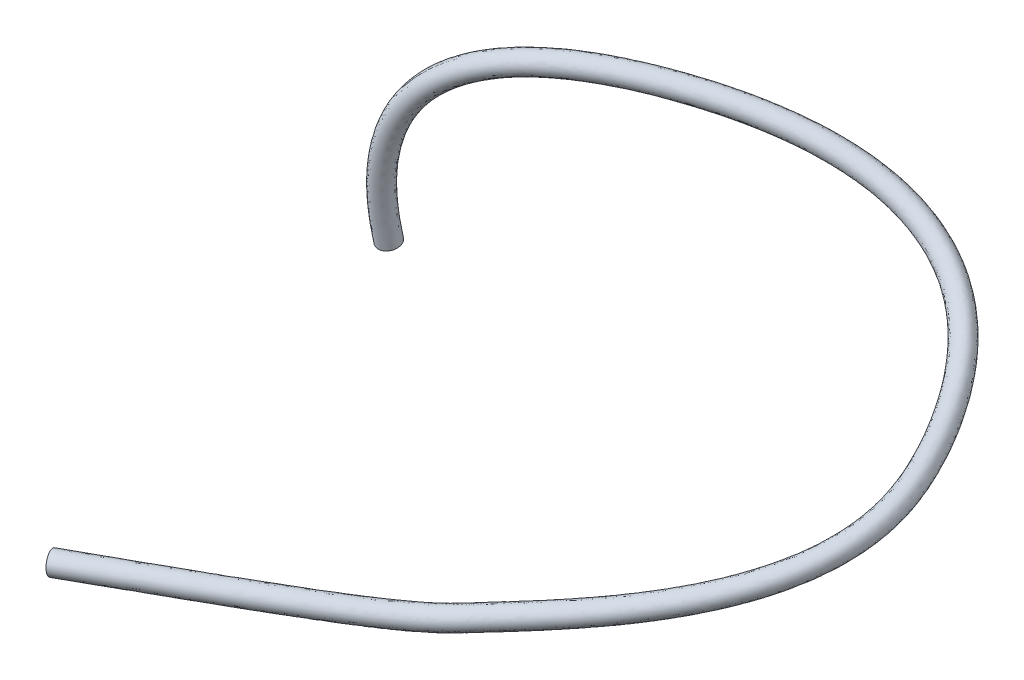
ISO-10303-21;
HEADER;
FILE_DESCRIPTION(('STEP AP214'),'2;1');
FILE_NAME('part.step','',(''),(''),'','','');
FILE_SCHEMA(('AUTOMOTIVE_DESIGN { 1 0 10303 214 1 1 1 1 }'));
ENDSEC;
DATA;
#1=APPLICATION_CONTEXT('core data for automotive mechanical design processes');
#2=APPLICATION_PROTOCOL_DEFINITION('international standard','automotive_design',2000,#1);
#3=PRODUCT_CONTEXT('',#1,'mechanical');
#4=PRODUCT('Part','Part','',(#3));
#5=PRODUCT_RELATED_PRODUCT_CATEGORY('part','',(#4));
#6=PRODUCT_DEFINITION_FORMATION('','',#4);
#7=PRODUCT_DEFINITION_CONTEXT('part definition',#1,'design');
#8=PRODUCT_DEFINITION('design','',#6,#7);
#9=PRODUCT_DEFINITION_SHAPE('','',#8);
#10=(LENGTH_UNIT() NAMED_UNIT(*) SI_UNIT(.MILLI.,.METRE.));
#11=(NAMED_UNIT(*) PLANE_ANGLE_UNIT() SI_UNIT($,.RADIAN.));
#12=(NAMED_UNIT(*) SI_UNIT($,.STERADIAN.) SOLID_ANGLE_UNIT());
#13=UNCERTAINTY_MEASURE_WITH_UNIT(LENGTH_MEASURE(1.E-05),#10,'distance_accuracy_value','');
#14=(GEOMETRIC_REPRESENTATION_CONTEXT(3) GLOBAL_UNCERTAINTY_ASSIGNED_CONTEXT((#13)) GLOBAL_UNIT_ASSIGNED_CONTEXT((#10,
#11,#12)) REPRESENTATION_CONTEXT('',''));
#15=CARTESIAN_POINT('',(0.,0.,0.));
#16=DIRECTION('',(0.,0.,1.));
#17=DIRECTION('',(1.,0.,0.));
#18=AXIS2_PLACEMENT_3D('',#15,#16,#17);
#19=CARTESIAN_POINT('',(0.,0.,0.));
#20=DIRECTION('',(0.921927770547617,0.0852639485478055,-0.377861409740579));
#21=DIRECTION('',(-0.379242459494536,0.,-0.925297334329098));
#22=AXIS2_PLACEMENT_3D('',#19,#20,#21);
#23=PLANE('',#22);
#24=CARTESIAN_POINT('',(0.,0.,0.));
#25=DIRECTION('',(0.921927770547617,0.0852639485478055,-0.377861409740579));
#26=DIRECTION('',(-0.379242459494536,0.,-0.925297334329098));
#27=AXIS2_PLACEMENT_3D('',#24,#25,#26);
#28=CIRCLE('',#27,0.7);
#29=CARTESIAN_POINT('',(-0.265469721646175,0.,-0.647708134030369));
#30=VERTEX_POINT('',#29);
#31=EDGE_CURVE('E44',#30,#30,#28,.T.);
#32=ORIENTED_EDGE('',*,*,#31,.F.);
#33=EDGE_LOOP('',(#32));
#34=FACE_BOUND('',#33,.T.);
#35=ADVANCED_FACE('F38',(#34),#23,.F.);
#36=CARTESIAN_POINT('',(-5.57062917774055,1.68555245021381,-27.7769632366974));
#37=DIRECTION('',(0.0297499683186175,-0.979324675837005,-0.20009527401162));
#38=DIRECTION('',(0.839482302263919,0.133142151646618,-0.526823150251179));
#39=AXIS2_PLACEMENT_3D('',#36,#37,#38);
#40=PLANE('',#39);
#41=CARTESIAN_POINT('',(-5.57062917774055,1.68555245021381,-27.7769632366974));
#42=DIRECTION('',(0.0297499683186175,-0.979324675837005,-0.20009527401162));
#43=DIRECTION('',(0.839482302263919,0.133142151646618,-0.526823150251179));
#44=AXIS2_PLACEMENT_3D('',#41,#42,#43);
#45=CIRCLE('',#44,0.7);
#46=CARTESIAN_POINT('',(-4.9829915661558,1.77875195636644,-28.1457394418732));
#47=VERTEX_POINT('',#46);
#48=EDGE_CURVE('E10',#47,#47,#45,.T.);
#49=ORIENTED_EDGE('',*,*,#48,.T.);
#50=EDGE_LOOP('',(#49));
#51=FACE_BOUND('',#50,.T.);
#52=ADVANCED_FACE('F54',(#51),#40,.T.);
#53=CARTESIAN_POINT('',(-0.265469721646175,0.,-0.647708134030369));
#54=CARTESIAN_POINT('',(8.04734689797541,0.768805964165485,-4.05479999862704));
#55=CARTESIAN_POINT('',(12.3484093248188,1.22838460898763,-5.81049366290598));
#56=CARTESIAN_POINT('',(17.5599920455362,1.99534837302523,-7.98837642652316));
#57=CARTESIAN_POINT('',(18.4603030728046,2.29892115922044,-8.40554721821385));
#58=CARTESIAN_POINT('',(21.0902341526972,3.08996730017522,-9.67343388171896));
#59=CARTESIAN_POINT('',(22.4586381776187,3.47424883781394,-10.3421751297523));
#60=CARTESIAN_POINT('',(25.3065169394912,4.407975777979,-11.9742573344746));
#61=CARTESIAN_POINT('',(26.7994868445815,4.89454978585081,-12.94498891061));
#62=CARTESIAN_POINT('',(29.4443901043949,5.88640908324926,-15.1780349631807));
#63=CARTESIAN_POINT('',(30.5942325367993,6.38772173710995,-16.439904674247));
#64=CARTESIAN_POINT('',(32.1180610249669,7.33728800837294,-19.2117081331931));
#65=CARTESIAN_POINT('',(32.4995446619067,7.78360543197781,-20.7108380500078));
#66=CARTESIAN_POINT('',(32.2191859064397,8.39964260793526,-23.2303285719821));
#67=CARTESIAN_POINT('',(31.969766234403,8.60285047913527,-24.1520790348935));
#68=CARTESIAN_POINT('',(31.2873226083179,9.01388339667321,-25.976768871155));
#69=CARTESIAN_POINT('',(30.8535934152514,9.23126434571914,-26.875973582872));
#70=CARTESIAN_POINT('',(29.2700527287804,9.95748660976253,-29.8096529840923));
#71=CARTESIAN_POINT('',(28.0457719773137,10.5510144180114,-31.3476782521876));
#72=CARTESIAN_POINT('',(25.3555406090223,11.7472630306333,-33.5017084741541));
#73=CARTESIAN_POINT('',(23.8887536917995,12.3512112860404,-34.1234485430148));
#74=CARTESIAN_POINT('',(20.5754867734265,13.4643222618016,-34.653553123724));
#75=CARTESIAN_POINT('',(18.7263443808723,13.9726730883793,-34.5580201879179));
#76=CARTESIAN_POINT('',(16.1210154979731,14.4730370120324,-34.0828835682284));
#77=CARTESIAN_POINT('',(15.5853916467058,14.5664055022754,-33.970084866824));
#78=CARTESIAN_POINT('',(14.4841298461186,14.7381254029306,-33.7112159618186));
#79=CARTESIAN_POINT('',(13.9173931256621,14.8169735643044,-33.567919704245));
#80=CARTESIAN_POINT('',(12.1955771622092,15.0241275550784,-33.01837191714));
#81=CARTESIAN_POINT('',(10.9931676152545,15.1230135396024,-32.5775703221065));
#82=CARTESIAN_POINT('',(8.86819769619042,15.2092310754832,-31.7527038255509));
#83=CARTESIAN_POINT('',(7.98673132065368,15.2218329138705,-31.3898025572606));
#84=CARTESIAN_POINT('',(6.20884725001329,15.1629747195817,-30.674732275419));
#85=CARTESIAN_POINT('',(5.29979330863319,15.094157275259,-30.3522766667526));
#86=CARTESIAN_POINT('',(2.66547604715391,14.7035557392917,-29.3365822631745));
#87=CARTESIAN_POINT('',(1.00532455651187,14.1941531668651,-28.6762716249753));
#88=CARTESIAN_POINT('',(-1.81284451540269,12.4149402778109,-27.6931445094202));
#89=CARTESIAN_POINT('',(-2.97767835802037,11.1603283469936,-27.3614815290386));
#90=CARTESIAN_POINT('',(-4.61356550596176,7.47757133475727,-27.2507518488822));
#91=CARTESIAN_POINT('',(-5.07903623342048,5.02833238472527,-27.4775297586939));
#92=CARTESIAN_POINT('',(-4.9829915661558,1.77875195636644,-28.1457394418732));
#93=CARTESIAN_POINT('',(-0.375922027674096,1.39490175847368,-0.602438140655489));
#94=CARTESIAN_POINT('',(7.93101144108461,2.16316362288373,-4.00711873644197));
#95=CARTESIAN_POINT('',(12.2248899466134,2.62311788710211,-5.76009881014715));
#96=CARTESIAN_POINT('',(17.3350313678108,3.37515295392694,-7.89558846081438));
#97=CARTESIAN_POINT('',(18.1084503751173,3.64569290139753,-8.25491684524395));
#98=CARTESIAN_POINT('',(20.7631626347276,4.44419287057274,-9.53475047936855));
#99=CARTESIAN_POINT('',(22.1169200635808,4.82791781967141,-10.2230668577507));
#100=CARTESIAN_POINT('',(25.0147494648275,5.76002969570236,-11.7502044204553));
#101=CARTESIAN_POINT('',(26.509986500736,6.24410760506727,-12.7102811444184));
#102=CARTESIAN_POINT('',(29.1551753102642,7.23083219628691,-14.9151932084917));
#103=CARTESIAN_POINT('',(30.2996286434899,7.72878769815231,-16.1658699926814));
#104=CARTESIAN_POINT('',(31.8122922688031,8.66844422219033,-18.9036935643062));
#105=CARTESIAN_POINT('',(32.1890101572306,9.1079369347797,-20.3786828458651));
#106=CARTESIAN_POINT('',(31.9148470068129,9.71571481341774,-22.8622368756107));
#107=CARTESIAN_POINT('',(31.6687027595613,9.91528131093255,-23.7681735103063));
#108=CARTESIAN_POINT('',(31.0015470930621,10.3171062000914,-25.5519865324197));
#109=CARTESIAN_POINT('',(30.5968546946634,10.5359934759053,-26.4347663416798));
#110=CARTESIAN_POINT('',(28.9798465847973,11.1893020397665,-29.1955521347728));
#111=CARTESIAN_POINT('',(27.7706897561747,11.7068667154695,-30.5848789492727));
#112=CARTESIAN_POINT('',(25.2140127055754,12.6974113662346,-32.4669546241287));
#113=CARTESIAN_POINT('',(23.8637782697511,13.1750809480492,-32.9767688518459));
#114=CARTESIAN_POINT('',(20.7630329426641,14.0186138617256,-33.3683112930781));
#115=CARTESIAN_POINT('',(19.0051518394409,14.3821161257118,-33.2349943719279));
#116=CARTESIAN_POINT('',(16.4809933245799,14.6611221839767,-32.7422584009519));
#117=CARTESIAN_POINT('',(15.9601744924253,14.7082262274235,-32.6277231659809));
#118=CARTESIAN_POINT('',(14.8858048370136,14.7834233334544,-32.3699048367272));
#119=CARTESIAN_POINT('',(14.3306956594957,14.8060406155557,-32.2302404118288));
#120=CARTESIAN_POINT('',(12.6563701683718,14.9926542096388,-31.6962611619195));
#121=CARTESIAN_POINT('',(11.4798125160383,15.0991131584168,-31.2649307674183));
#122=CARTESIAN_POINT('',(9.38678250045084,15.1840348370792,-30.4524626359805));
#123=CARTESIAN_POINT('',(8.5134741169553,15.2087533354524,-30.092654517976));
#124=CARTESIAN_POINT('',(6.74685160728854,15.1227918347798,-29.3827730150804));
#125=CARTESIAN_POINT('',(5.84571078080949,14.9503140909322,-29.0702821083973));
#126=CARTESIAN_POINT('',(3.23978128735995,14.424865885769,-28.0870172816255));
#127=CARTESIAN_POINT('',(1.60646070768647,13.8896448177217,-27.4485563096139));
#128=CARTESIAN_POINT('',(-1.14942589637044,12.0940895625962,-26.5022182073086));
#129=CARTESIAN_POINT('',(-2.28046544903582,10.857613866887,-26.1853287134096));
#130=CARTESIAN_POINT('',(-3.87276232097623,7.22136152444323,-26.0903017134173));
#131=CARTESIAN_POINT('',(-4.32725774462034,4.79684065636458,-26.3192384811183));
#132=CARTESIAN_POINT('',(-4.22339072953265,1.56552709938856,-26.9892180502128));
#133=CARTESIAN_POINT('',(0.155017415618254,1.39490175847368,0.692978127405248));
#134=CARTESIAN_POINT('',(8.46131785457856,2.16310507749357,-2.71144301471895));
#135=CARTESIAN_POINT('',(12.7531041920763,2.62255009845854,-4.46350851368374));
#136=CARTESIAN_POINT('',(17.8861583055394,3.37795569209155,-6.6085732116754));
#137=CARTESIAN_POINT('',(18.7050006075183,3.66000006594986,-6.98842778789464));
#138=CARTESIAN_POINT('',(21.372139900737,4.46223790496901,-8.2742524801526));
#139=CARTESIAN_POINT('',(22.7520102993758,4.87814266684626,-8.97387273679174));
#140=CARTESIAN_POINT('',(25.7677624320915,5.72639835191649,-10.5677542102461));
#141=CARTESIAN_POINT('',(27.3278189083292,6.22018304941918,-11.5684897194397));
#142=CARTESIAN_POINT('',(30.1450811904828,7.24818241415945,-13.9187519377934));
#143=CARTESIAN_POINT('',(31.4009704317679,7.78565117687617,-15.2750096212924));
#144=CARTESIAN_POINT('',(33.1211034266045,8.84690790666511,-18.3889281310212));
#145=CARTESIAN_POINT('',(33.5788596378416,9.37235995472641,-20.1560391181925));
#146=CARTESIAN_POINT('',(33.2562180512698,10.0855290050245,-23.0807027873142));
#147=CARTESIAN_POINT('',(32.9778676237618,10.3064459586588,-24.0833538314746));
#148=CARTESIAN_POINT('',(32.2564688142089,10.7409414172486,-26.0121997907204));
#149=CARTESIAN_POINT('',(31.8311499063581,10.9520369970438,-26.9507674739337));
#150=CARTESIAN_POINT('',(30.1232066233792,11.7481721009636,-29.7944645956167));
#151=CARTESIAN_POINT('',(28.8185523689641,12.3752346687752,-31.254088094744));
#152=CARTESIAN_POINT('',(25.9995817424236,13.6010386692232,-33.2145585574702));
#153=CARTESIAN_POINT('',(24.4842237540822,14.2020148127367,-33.7210006554385));
#154=CARTESIAN_POINT('',(21.1153940032034,15.2475349246573,-33.9674952746369));
#155=CARTESIAN_POINT('',(19.2598768159327,15.691341620999,-33.7002975460282));
#156=CARTESIAN_POINT('',(16.676594666756,16.0264752250778,-32.9867326150697));
#157=CARTESIAN_POINT('',(16.146823241944,16.0824932569383,-32.8253283992722));
#158=CARTESIAN_POINT('',(15.059860674557,16.1699115497657,-32.4691542370807));
#159=CARTESIAN_POINT('',(14.503308720724,16.1948425297148,-32.2724550662386));
#160=CARTESIAN_POINT('',(12.7824507844757,16.3874156887399,-31.7079448055625));
#161=CARTESIAN_POINT('',(11.5700483514724,16.4965976839657,-31.2734734699733));
#162=CARTESIAN_POINT('',(9.42332982368569,16.5836976953562,-30.4401647036021));
#163=CARTESIAN_POINT('',(8.51620115581398,16.6093548298653,-30.0798209457498));
#164=CARTESIAN_POINT('',(6.68450292307777,16.520351846506,-29.3135246467413));
#165=CARTESIAN_POINT('',(5.77737914129231,16.3386088162421,-28.8857277665899));
#166=CARTESIAN_POINT('',(3.05556149592187,15.7679227081138,-27.7040962844886));
#167=CARTESIAN_POINT('',(1.26986186991994,15.1862255648304,-26.9676144032409));
#168=CARTESIAN_POINT('',(-1.87434961411993,13.1169500542312,-25.8284470739414));
#169=CARTESIAN_POINT('',(-3.22770249839462,11.6228334269012,-25.4344422520184));
#170=CARTESIAN_POINT('',(-5.04478460142034,7.44383951978543,-25.3006709135659));
#171=CARTESIAN_POINT('',(-5.51291709260952,4.77640576798852,-25.5562894420362));
#172=CARTESIAN_POINT('',(-5.39866595270214,1.37912808708329,-26.2516656398612));
#173=CARTESIAN_POINT('',(0.265469721646175,0.,0.647708134030369));
#174=CARTESIAN_POINT('',(8.57765331146923,0.768747418775325,-2.75912427690402));
#175=CARTESIAN_POINT('',(12.876623570283,1.22781682034406,-4.51390336644195));
#176=CARTESIAN_POINT('',(18.1111189832635,1.99815111118984,-6.7013611773848));
#177=CARTESIAN_POINT('',(19.0568533052057,2.31322832377258,-7.13905816086415));
#178=CARTESIAN_POINT('',(21.6992114187067,3.10801233457162,-8.41293588250327));
#179=CARTESIAN_POINT('',(23.0937284134138,3.52447368498878,-9.09298100879334));
#180=CARTESIAN_POINT('',(26.0595299067552,4.37434443419313,-10.7918071242654));
#181=CARTESIAN_POINT('',(27.6173192521763,4.87062523020272,-11.8031974856329));
#182=CARTESIAN_POINT('',(30.4342959846119,5.90375930112181,-14.1815936924808));
#183=CARTESIAN_POINT('',(31.6955743250758,6.44458521583381,-15.549044302858));
#184=CARTESIAN_POINT('',(33.4268721827698,7.5157516928477,-18.6969426999082));
#185=CARTESIAN_POINT('',(33.8893941425176,8.04802845192371,-20.4881943223351));
#186=CARTESIAN_POINT('',(33.5605569508967,8.76945679954245,-23.4487944836857));
#187=CARTESIAN_POINT('',(33.2789310986035,8.99401512686178,-24.4672593560619));
#188=CARTESIAN_POINT('',(32.5422443294647,9.43771861383018,-26.4369821294557));
#189=CARTESIAN_POINT('',(32.087888626946,9.64730786685766,-27.391974715126));
#190=CARTESIAN_POINT('',(30.4134127673623,10.5163566709596,-30.4085654449363));
#191=CARTESIAN_POINT('',(29.0936345901031,11.219382371317,-32.0168873976588));
#192=CARTESIAN_POINT('',(26.1411096458706,12.650890333622,-34.2493124074956));
#193=CARTESIAN_POINT('',(24.5091991761305,13.3781451507279,-34.8676803466074));
#194=CARTESIAN_POINT('',(20.9278478339658,14.6932433247332,-35.2527371052828));
#195=CARTESIAN_POINT('',(18.9810693573641,15.2818985836665,-35.0233233620182));
#196=CARTESIAN_POINT('',(16.3166168401492,15.8383900531335,-34.3273577823463));
#197=CARTESIAN_POINT('',(15.7720403962244,15.9406725317905,-34.1676901001153));
#198=CARTESIAN_POINT('',(14.6581856836619,16.1246136192416,-33.810465362172));
#199=CARTESIAN_POINT('',(14.0900061868904,16.205775478463,-33.6101343586547));
#200=CARTESIAN_POINT('',(12.3216577783132,16.4188890341806,-33.0300555607831));
#201=CARTESIAN_POINT('',(11.0834034506886,16.5204980651513,-32.5861130246639));
#202=CARTESIAN_POINT('',(8.90474501942527,16.6088939337601,-31.7404058931709));
#203=CARTESIAN_POINT('',(7.98945835951236,16.6224344082839,-31.3769689850335));
#204=CARTESIAN_POINT('',(6.14649856580252,16.5605347313075,-30.6054839070807));
#205=CARTESIAN_POINT('',(5.23146166911601,16.4824520005694,-30.1677223249469));
#206=CARTESIAN_POINT('',(2.48125625571583,16.0466125616357,-28.9536612660342));
#207=CARTESIAN_POINT('',(0.668725718745165,15.4907339139738,-28.1953297186023));
#208=CARTESIAN_POINT('',(-2.53776823315201,13.4378007694459,-27.019373376053));
#209=CARTESIAN_POINT('',(-3.92491540737964,11.9255479070078,-26.6105950676473));
#210=CARTESIAN_POINT('',(-5.7855877864054,7.70004933009947,-26.4611210490309));
#211=CARTESIAN_POINT('',(-6.26469558140966,5.00789749634994,-26.7145807196118));
#212=CARTESIAN_POINT('',(-6.15826678932529,1.59235294406118,-27.4081870315216));
#213=CARTESIAN_POINT('',(0.375922027674096,-1.39490175847368,0.60243814065549));
#214=CARTESIAN_POINT('',(8.69398876835989,-0.625610239942922,-2.80680553908909));
#215=CARTESIAN_POINT('',(13.0001429484897,-0.166916457770426,-4.56429821920016));
#216=CARTESIAN_POINT('',(18.3360796609876,0.61834653028814,-6.79414914309419));
#217=CARTESIAN_POINT('',(19.408706002893,0.966456581595295,-7.28968853383366));
#218=CARTESIAN_POINT('',(22.0262829366763,1.75378676417423,-8.55161928485395));
#219=CARTESIAN_POINT('',(23.4354465274517,2.17080470313131,-9.21208928079494));
#220=CARTESIAN_POINT('',(26.3512973814188,3.02229051646977,-11.0158600382846));
#221=CARTESIAN_POINT('',(27.9068195960234,3.52106741098627,-12.0379052518261));
#222=CARTESIAN_POINT('',(30.7235107787409,4.55933618808416,-14.4444354471682));
#223=CARTESIAN_POINT('',(31.9901782183837,5.10351925479144,-15.8230789844235));
#224=CARTESIAN_POINT('',(33.7326409389351,6.18459547903031,-19.0049572687951));
#225=CARTESIAN_POINT('',(34.1999286471936,6.72369694912101,-20.8203495264777));
#226=CARTESIAN_POINT('',(33.8648958505235,7.45338459406039,-23.8168861800571));
#227=CARTESIAN_POINT('',(33.5799945734452,7.68158429506473,-24.8511648806492));
#228=CARTESIAN_POINT('',(32.8280198447205,8.13449581041173,-26.861764468191));
#229=CARTESIAN_POINT('',(32.344627347534,8.34257873667149,-27.8331819563182));
#230=CARTESIAN_POINT('',(30.7036189113454,9.28454124095572,-31.0226662942559));
#231=CARTESIAN_POINT('',(29.3687168112421,10.0635300738589,-32.7796867005737));
#232=CARTESIAN_POINT('',(26.2826375493176,11.7007419980207,-35.284066257521));
#233=CARTESIAN_POINT('',(24.5341745981789,12.5542754887191,-36.0143600377763));
#234=CARTESIAN_POINT('',(20.7403016647283,14.1389517248091,-36.5379789359287));
#235=CARTESIAN_POINT('',(18.7022618987955,14.8724555463341,-36.3463491780082));
#236=CARTESIAN_POINT('',(15.9566390135424,15.6503048811892,-35.6679829496228));
#237=CARTESIAN_POINT('',(15.3972575505049,15.7988518066426,-35.5100518009585));
#238=CARTESIAN_POINT('',(14.2565106927669,16.0793156887175,-35.1517764872634));
#239=CARTESIAN_POINT('',(13.6767036530568,16.2167084272112,-34.9478136510709));
#240=CARTESIAN_POINT('',(11.8608647721506,16.4503623796212,-34.3521663160037));
#241=CARTESIAN_POINT('',(10.5967585499048,16.5443984463369,-33.8987525793545));
#242=CARTESIAN_POINT('',(8.38616021516485,16.6340901721641,-33.0406470827396));
#243=CARTESIAN_POINT('',(7.46271556321074,16.6355139867024,-32.6741170243172));
#244=CARTESIAN_POINT('',(5.60849420852728,16.600717616109,-31.8974431674202));
#245=CARTESIAN_POINT('',(4.68554419693971,16.6262951848967,-31.4497168833038));
#246=CARTESIAN_POINT('',(1.90695101550979,16.3253024151576,-30.2032262475797));
#247=CARTESIAN_POINT('',(0.0675895675703881,15.7952422631172,-29.4230450339636));
#248=CARTESIAN_POINT('',(-3.20118685218408,13.7586514846606,-28.2102996781646));
#249=CARTESIAN_POINT('',(-4.62212831636466,12.2282623871144,-27.7867478832763));
#250=CARTESIAN_POINT('',(-6.52639097139045,7.95625914041351,-27.6215711844958));
#251=CARTESIAN_POINT('',(-7.01647407020979,5.23938922471136,-27.8728719971874));
#252=CARTESIAN_POINT('',(-6.91786762594844,1.80557780103906,-28.564708423182));
#253=CARTESIAN_POINT('',(-0.155017415618254,-1.39490175847368,-0.692978127405248));
#254=CARTESIAN_POINT('',(8.16368235486619,-0.625551694552762,-4.10248126081211));
#255=CARTESIAN_POINT('',(12.4719287030243,-0.166348669126853,-5.86088851566481));
#256=CARTESIAN_POINT('',(17.7849527232615,0.615543792123529,-8.08116439223193));
#257=CARTESIAN_POINT('',(18.812155770492,0.952149417043357,-8.55617759118375));
#258=CARTESIAN_POINT('',(21.4173056706669,1.73574172977769,-9.81211728406937));
#259=CARTESIAN_POINT('',(22.8003562916567,2.12057985595646,-10.4612834017539));
#260=CARTESIAN_POINT('',(25.5982844141548,3.05592186025564,-12.1983102484939));
#261=CARTESIAN_POINT('',(27.0889871884271,3.54499196663436,-13.1796966768016));
#262=CARTESIAN_POINT('',(29.7336048985256,4.54198597021162,-15.4408767178697));
#263=CARTESIAN_POINT('',(30.8888364301087,5.04665577606758,-16.7139393558125));
#264=CARTESIAN_POINT('',(32.4238297811307,6.00613179455554,-19.5197227020801));
#265=CARTESIAN_POINT('',(32.8100791665827,6.45927392917592,-21.0429932541504));
#266=CARTESIAN_POINT('',(32.5235248060666,7.08357040245279,-23.5984202683536));
#267=CARTESIAN_POINT('',(32.2708297092446,7.29041964733799,-24.5359845594808));
#268=CARTESIAN_POINT('',(31.5730981235737,7.71066059325498,-26.4015512098903));
#269=CARTESIAN_POINT('',(31.1103321358393,7.92653521553297,-27.3171808240643));
#270=CARTESIAN_POINT('',(29.5602588727635,8.72567117975861,-30.4237538334119));
#271=CARTESIAN_POINT('',(28.3208541984527,9.39516212055317,-32.1104775551024));
#272=CARTESIAN_POINT('',(25.4970685124694,10.797114695032,-34.5364623241796));
#273=CARTESIAN_POINT('',(23.9137291138479,11.5273416240316,-35.2701282341837));
#274=CARTESIAN_POINT('',(20.3879406041889,12.9100306618775,-35.9387949543699));
#275=CARTESIAN_POINT('',(18.4475369223038,13.5632300510468,-35.8810460039079));
#276=CARTESIAN_POINT('',(15.7610376713663,14.2849518400882,-35.423508735505));
#277=CARTESIAN_POINT('',(15.2106088009863,14.4245847771273,-35.3124465676672));
#278=CARTESIAN_POINT('',(14.0824548552235,14.6928274724068,-35.0525270869099));
#279=CARTESIAN_POINT('',(13.5040905918285,14.8279065130532,-34.9055989966611));
#280=CARTESIAN_POINT('',(11.7347841560467,15.0556009005179,-34.3404826723606));
#281=CARTESIAN_POINT('',(10.5065227144707,15.1469139207879,-33.8902098767947));
#282=CARTESIAN_POINT('',(8.34961289193,15.2344273138872,-33.0529450151213));
#283=CARTESIAN_POINT('',(7.45998852435206,15.2349124922887,-32.6869505965451));
#284=CARTESIAN_POINT('',(5.67084289273805,15.2031576043837,-31.9666915357576));
#285=CARTESIAN_POINT('',(4.7538758364569,15.2380004595859,-31.6342712251079));
#286=CARTESIAN_POINT('',(2.09117080694787,14.9822455928144,-30.5861472447235));
#287=CARTESIAN_POINT('',(0.404188405337268,14.4986615160085,-29.9039869403366));
#288=CARTESIAN_POINT('',(-2.47626313443494,12.7357909930256,-28.8840708115318));
#289=CARTESIAN_POINT('',(-3.67489126700492,11.4630428271002,-28.5376343446675));
#290=CARTESIAN_POINT('',(-5.35436869094728,7.73378114507131,-28.4112019843472));
#291=CARTESIAN_POINT('',(-5.83081472222061,5.25982411308595,-28.6358210362695));
#292=CARTESIAN_POINT('',(-5.74259240277895,1.99197681334433,-29.3022608335337));
#293=CARTESIAN_POINT('',(-0.265469721646175,0.,-0.647708134030369));
#294=CARTESIAN_POINT('',(8.04734689797541,0.768805964165485,-4.05479999862704));
#295=CARTESIAN_POINT('',(12.3484093248188,1.22838460898763,-5.81049366290598));
#296=CARTESIAN_POINT('',(17.5599920455362,1.99534837302523,-7.98837642652316));
#297=CARTESIAN_POINT('',(18.4603030728046,2.29892115922044,-8.40554721821385));
#298=CARTESIAN_POINT('',(21.0902341526972,3.08996730017522,-9.67343388171896));
#299=CARTESIAN_POINT('',(22.4586381776187,3.47424883781394,-10.3421751297523));
#300=CARTESIAN_POINT('',(25.3065169394912,4.407975777979,-11.9742573344746));
#301=CARTESIAN_POINT('',(26.7994868445815,4.89454978585081,-12.94498891061));
#302=CARTESIAN_POINT('',(29.4443901043949,5.88640908324926,-15.1780349631807));
#303=CARTESIAN_POINT('',(30.5942325367993,6.38772173710995,-16.439904674247));
#304=CARTESIAN_POINT('',(32.1180610249669,7.33728800837294,-19.2117081331931));
#305=CARTESIAN_POINT('',(32.4995446619067,7.78360543197781,-20.7108380500078));
#306=CARTESIAN_POINT('',(32.2191859064397,8.39964260793526,-23.2303285719821));
#307=CARTESIAN_POINT('',(31.969766234403,8.60285047913527,-24.1520790348935));
#308=CARTESIAN_POINT('',(31.2873226083179,9.01388339667321,-25.976768871155));
#309=CARTESIAN_POINT('',(30.8535934152514,9.23126434571914,-26.875973582872));
#310=CARTESIAN_POINT('',(29.2700527287804,9.95748660976253,-29.8096529840923));
#311=CARTESIAN_POINT('',(28.0457719773137,10.5510144180114,-31.3476782521876));
#312=CARTESIAN_POINT('',(25.3555406090223,11.7472630306333,-33.5017084741541));
#313=CARTESIAN_POINT('',(23.8887536917995,12.3512112860404,-34.1234485430148));
#314=CARTESIAN_POINT('',(20.5754867734265,13.4643222618016,-34.653553123724));
#315=CARTESIAN_POINT('',(18.7263443808723,13.9726730883793,-34.5580201879179));
#316=CARTESIAN_POINT('',(16.1210154979731,14.4730370120324,-34.0828835682284));
#317=CARTESIAN_POINT('',(15.5853916467058,14.5664055022754,-33.970084866824));
#318=CARTESIAN_POINT('',(14.4841298461186,14.7381254029306,-33.7112159618186));
#319=CARTESIAN_POINT('',(13.9173931256621,14.8169735643044,-33.567919704245));
#320=CARTESIAN_POINT('',(12.1955771622092,15.0241275550784,-33.01837191714));
#321=CARTESIAN_POINT('',(10.9931676152545,15.1230135396024,-32.5775703221065));
#322=CARTESIAN_POINT('',(8.86819769619042,15.2092310754832,-31.7527038255509));
#323=CARTESIAN_POINT('',(7.98673132065368,15.2218329138705,-31.3898025572606));
#324=CARTESIAN_POINT('',(6.20884725001329,15.1629747195817,-30.674732275419));
#325=CARTESIAN_POINT('',(5.29979330863319,15.094157275259,-30.3522766667526));
#326=CARTESIAN_POINT('',(2.66547604715391,14.7035557392917,-29.3365822631745));
#327=CARTESIAN_POINT('',(1.00532455651187,14.1941531668651,-28.6762716249753));
#328=CARTESIAN_POINT('',(-1.81284451540269,12.4149402778109,-27.6931445094202));
#329=CARTESIAN_POINT('',(-2.97767835802037,11.1603283469936,-27.3614815290386));
#330=CARTESIAN_POINT('',(-4.61356550596176,7.47757133475727,-27.2507518488822));
#331=CARTESIAN_POINT('',(-5.07903623342048,5.02833238472527,-27.4775297586939));
#332=CARTESIAN_POINT('',(-4.9829915661558,1.77875195636644,-28.1457394418732));
#333=(BOUNDED_SURFACE() B_SPLINE_SURFACE(3,3,((#53,#54,#55,#56,#57,#58,#59,#60,#61,#62,#63,#64,
#65,#66,#67,#68,#69,#70,#71,#72,#73,#74,#75,#76,#77,#78,#79,#80,#81,#82,#83,#84,#85,#86,#87,#88,
#89,#90,#91,#92),(#93,#94,#95,#96,#97,#98,#99,#100,#101,#102,#103,#104,#105,#106,#107,#108,#109,
#110,#111,#112,#113,#114,#115,#116,#117,#118,#119,#120,#121,#122,#123,#124,#125,#126,#127,#128,
#129,#130,#131,#132),(#133,#134,#135,#136,#137,#138,#139,#140,#141,#142,#143,#144,#145,#146,
#147,#148,#149,#150,#151,#152,#153,#154,#155,#156,#157,#158,#159,#160,#161,#162,#163,#164,#165,
#166,#167,#168,#169,#170,#171,#172),(#173,#174,#175,#176,#177,#178,#179,#180,#181,#182,#183,
#184,#185,#186,#187,#188,#189,#190,#191,#192,#193,#194,#195,#196,#197,#198,#199,#200,#201,#202,
#203,#204,#205,#206,#207,#208,#209,#210,#211,#212),(#213,#214,#215,#216,#217,#218,#219,#220,
#221,#222,#223,#224,#225,#226,#227,#228,#229,#230,#231,#232,#233,#234,#235,#236,#237,#238,#239,
#240,#241,#242,#243,#244,#245,#246,#247,#248,#249,#250,#251,#252),(#253,#254,#255,#256,#257,
#258,#259,#260,#261,#262,#263,#264,#265,#266,#267,#268,#269,#270,#271,#272,#273,#274,#275,#276,
#277,#278,#279,#280,#281,#282,#283,#284,#285,#286,#287,#288,#289,#290,#291,#292),(#293,#294,
#295,#296,#297,#298,#299,#300,#301,#302,#303,#304,#305,#306,#307,#308,#309,#310,#311,#312,#313,
#314,#315,#316,#317,#318,#319,#320,#321,#322,#323,#324,#325,#326,#327,#328,#329,#330,#331,
#332)),.UNSPECIFIED.,.T.,.F.,.F.) B_SPLINE_SURFACE_WITH_KNOTS((4,3,4),(4,2,2,2,2,2,2,2,2,2,2,2,
2,2,2,2,2,2,2,4),(0.,0.5,1.),(0.,0.0869812584059887,0.173962516811977,0.234105602824734,
0.294248688837491,0.354391774850248,0.414534860863005,0.445241769016106,0.475948677169207,
0.553986677845439,0.632024678521671,0.710062679197902,0.72957217936696,0.749081679536018,
0.788100679874134,0.814588094889867,0.8410755099056,0.894050339937067,0.947025169968533,1.),
.UNSPECIFIED.) GEOMETRIC_REPRESENTATION_ITEM() RATIONAL_B_SPLINE_SURFACE(((1.,1.,1.,1.,1.,1.,1.,
1.,1.,1.,1.,1.,1.,1.,1.,1.,1.,1.,1.,1.,1.,1.,1.,1.,1.,1.,1.,1.,1.,1.,1.,1.,1.,1.,1.,1.,1.,1.,1.,
1.),(0.333333333333333,0.333333333333333,0.333333333333333,0.333333333333333,0.333333333333333,
0.333333333333333,0.333333333333333,0.333333333333333,0.333333333333333,0.333333333333333,
0.333333333333333,0.333333333333333,0.333333333333333,0.333333333333333,0.333333333333333,
0.333333333333333,0.333333333333333,0.333333333333333,0.333333333333333,0.333333333333333,
0.333333333333333,0.333333333333333,0.333333333333333,0.333333333333333,0.333333333333333,
0.333333333333333,0.333333333333333,0.333333333333333,0.333333333333333,0.333333333333333,
0.333333333333333,0.333333333333333,0.333333333333333,0.333333333333333,0.333333333333333,
0.333333333333333,0.333333333333333,0.333333333333333,0.333333333333333,0.333333333333333),
(0.333333333333333,0.333333333333333,0.333333333333333,0.333333333333333,0.333333333333333,
0.333333333333333,0.333333333333333,0.333333333333333,0.333333333333333,0.333333333333333,
0.333333333333333,0.333333333333333,0.333333333333333,0.333333333333333,0.333333333333333,
0.333333333333333,0.333333333333333,0.333333333333333,0.333333333333333,0.333333333333333,
0.333333333333333,0.333333333333333,0.333333333333333,0.333333333333333,0.333333333333333,
0.333333333333333,0.333333333333333,0.333333333333333,0.333333333333333,0.333333333333333,
0.333333333333333,0.333333333333333,0.333333333333333,0.333333333333333,0.333333333333333,
0.333333333333333,0.333333333333333,0.333333333333333,0.333333333333333,0.333333333333333),(1.,
1.,1.,1.,1.,1.,1.,1.,1.,1.,1.,1.,1.,1.,1.,1.,1.,1.,1.,1.,1.,1.,1.,1.,1.,1.,1.,1.,1.,1.,1.,1.,1.,
1.,1.,1.,1.,1.,1.,1.),(0.333333333333333,0.333333333333333,0.333333333333333,0.333333333333333,
0.333333333333333,0.333333333333333,0.333333333333333,0.333333333333333,0.333333333333333,
0.333333333333333,0.333333333333333,0.333333333333333,0.333333333333333,0.333333333333333,
0.333333333333333,0.333333333333333,0.333333333333333,0.333333333333333,0.333333333333333,
0.333333333333333,0.333333333333333,0.333333333333333,0.333333333333333,0.333333333333333,
0.333333333333333,0.333333333333333,0.333333333333333,0.333333333333333,0.333333333333333,
0.333333333333333,0.333333333333333,0.333333333333333,0.333333333333333,0.333333333333333,
0.333333333333333,0.333333333333333,0.333333333333333,0.333333333333333,0.333333333333333,
0.333333333333333),(0.333333333333333,0.333333333333333,0.333333333333333,0.333333333333333,
0.333333333333333,0.333333333333333,0.333333333333333,0.333333333333333,0.333333333333333,
0.333333333333333,0.333333333333333,0.333333333333333,0.333333333333333,0.333333333333333,
0.333333333333333,0.333333333333333,0.333333333333333,0.333333333333333,0.333333333333333,
0.333333333333333,0.333333333333333,0.333333333333333,0.333333333333333,0.333333333333333,
0.333333333333333,0.333333333333333,0.333333333333333,0.333333333333333,0.333333333333333,
0.333333333333333,0.333333333333333,0.333333333333333,0.333333333333333,0.333333333333333,
0.333333333333333,0.333333333333333,0.333333333333333,0.333333333333333,0.333333333333333,
0.333333333333333),(1.,1.,1.,1.,1.,1.,1.,1.,1.,1.,1.,1.,1.,1.,1.,1.,1.,1.,1.,1.,1.,1.,1.,1.,1.,
1.,1.,1.,1.,1.,1.,1.,1.,1.,1.,1.,1.,1.,1.,1.))) REPRESENTATION_ITEM('') SURFACE());
#334=ORIENTED_EDGE('',*,*,#48,.F.);
#335=EDGE_LOOP('',(#334));
#336=FACE_BOUND('',#335,.T.);
#337=ORIENTED_EDGE('',*,*,#31,.T.);
#338=EDGE_LOOP('',(#337));
#339=FACE_BOUND('',#338,.T.);
#340=ADVANCED_FACE('F51',(#336,#339),#333,.T.);
#341=CLOSED_SHELL('',(#35,#52,#340));
#342=MANIFOLD_SOLID_BREP('B2',#341);
#343=ADVANCED_BREP_SHAPE_REPRESENTATION('',(#18,#342),#14);
#344=SHAPE_DEFINITION_REPRESENTATION(#9,#343);
ENDSEC;
END-ISO-10303-21;
